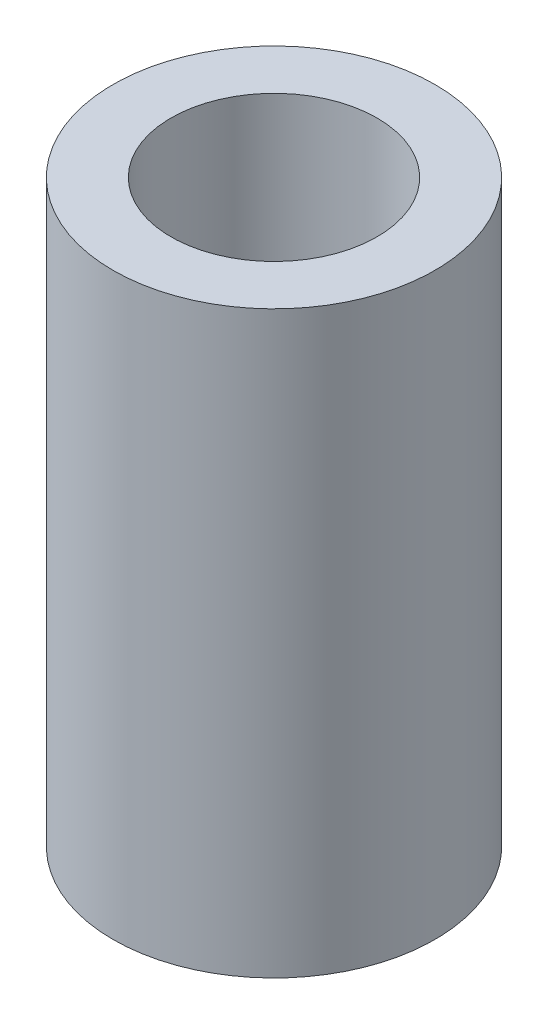
ISO-10303-21;
HEADER;
FILE_DESCRIPTION(('STEP AP214'),'2;1');
FILE_NAME('part.step','',(''),(''),'','','');
FILE_SCHEMA(('AUTOMOTIVE_DESIGN { 1 0 10303 214 1 1 1 1 }'));
ENDSEC;
DATA;
#1=APPLICATION_CONTEXT('core data for automotive mechanical design processes');
#2=APPLICATION_PROTOCOL_DEFINITION('international standard','automotive_design',2000,#1);
#3=PRODUCT_CONTEXT('',#1,'mechanical');
#4=PRODUCT('Part','Part','',(#3));
#5=PRODUCT_RELATED_PRODUCT_CATEGORY('part','',(#4));
#6=PRODUCT_DEFINITION_FORMATION('','',#4);
#7=PRODUCT_DEFINITION_CONTEXT('part definition',#1,'design');
#8=PRODUCT_DEFINITION('design','',#6,#7);
#9=PRODUCT_DEFINITION_SHAPE('','',#8);
#10=(LENGTH_UNIT() NAMED_UNIT(*) SI_UNIT(.MILLI.,.METRE.));
#11=(NAMED_UNIT(*) PLANE_ANGLE_UNIT() SI_UNIT($,.RADIAN.));
#12=(NAMED_UNIT(*) SI_UNIT($,.STERADIAN.) SOLID_ANGLE_UNIT());
#13=UNCERTAINTY_MEASURE_WITH_UNIT(LENGTH_MEASURE(1.E-05),#10,'distance_accuracy_value','');
#14=(GEOMETRIC_REPRESENTATION_CONTEXT(3) GLOBAL_UNCERTAINTY_ASSIGNED_CONTEXT((#13)) GLOBAL_UNIT_ASSIGNED_CONTEXT((#10,
#11,#12)) REPRESENTATION_CONTEXT('',''));
#15=CARTESIAN_POINT('',(0.,0.,0.));
#16=DIRECTION('',(0.,0.,1.));
#17=DIRECTION('',(1.,0.,0.));
#18=AXIS2_PLACEMENT_3D('',#15,#16,#17);
#19=CARTESIAN_POINT('',(0.,9.,0.));
#20=DIRECTION('',(0.,1.,0.));
#21=DIRECTION('',(0.,0.,-1.));
#22=AXIS2_PLACEMENT_3D('',#19,#20,#21);
#23=PLANE('',#22);
#24=CARTESIAN_POINT('',(0.,9.,0.));
#25=DIRECTION('',(0.,-1.,0.));
#26=DIRECTION('',(0.,0.,-1.));
#27=AXIS2_PLACEMENT_3D('',#24,#25,#26);
#28=CIRCLE('',#27,2.5);
#29=CARTESIAN_POINT('',(0.,9.,-2.5));
#30=VERTEX_POINT('',#29);
#31=EDGE_CURVE('E10',#30,#30,#28,.T.);
#32=ORIENTED_EDGE('',*,*,#31,.F.);
#33=EDGE_LOOP('',(#32));
#34=FACE_BOUND('',#33,.T.);
#35=CARTESIAN_POINT('',(0.,9.,0.));
#36=DIRECTION('',(0.,-1.,0.));
#37=DIRECTION('',(0.,0.,-1.));
#38=AXIS2_PLACEMENT_3D('',#35,#36,#37);
#39=CIRCLE('',#38,1.6);
#40=CARTESIAN_POINT('',(0.,9.,-1.6));
#41=VERTEX_POINT('',#40);
#42=EDGE_CURVE('E46',#41,#41,#39,.T.);
#43=ORIENTED_EDGE('',*,*,#42,.T.);
#44=EDGE_LOOP('',(#43));
#45=FACE_BOUND('',#44,.T.);
#46=ADVANCED_FACE('F35',(#34,#45),#23,.T.);
#47=CARTESIAN_POINT('',(0.,0.,0.));
#48=DIRECTION('',(0.,1.,0.));
#49=DIRECTION('',(0.,0.,-1.));
#50=AXIS2_PLACEMENT_3D('',#47,#48,#49);
#51=PLANE('',#50);
#52=CARTESIAN_POINT('',(0.,0.,0.));
#53=DIRECTION('',(0.,-1.,0.));
#54=DIRECTION('',(0.,0.,-1.));
#55=AXIS2_PLACEMENT_3D('',#52,#53,#54);
#56=CIRCLE('',#55,2.5);
#57=CARTESIAN_POINT('',(0.,0.,-2.5));
#58=VERTEX_POINT('',#57);
#59=EDGE_CURVE('E39',#58,#58,#56,.T.);
#60=ORIENTED_EDGE('',*,*,#59,.T.);
#61=EDGE_LOOP('',(#60));
#62=FACE_BOUND('',#61,.T.);
#63=CARTESIAN_POINT('',(0.,0.,0.));
#64=DIRECTION('',(0.,-1.,0.));
#65=DIRECTION('',(0.,0.,-1.));
#66=AXIS2_PLACEMENT_3D('',#63,#64,#65);
#67=CIRCLE('',#66,1.6);
#68=CARTESIAN_POINT('',(0.,0.,-1.6));
#69=VERTEX_POINT('',#68);
#70=EDGE_CURVE('E48',#69,#69,#67,.T.);
#71=ORIENTED_EDGE('',*,*,#70,.F.);
#72=EDGE_LOOP('',(#71));
#73=FACE_BOUND('',#72,.T.);
#74=ADVANCED_FACE('F61',(#62,#73),#51,.F.);
#75=CARTESIAN_POINT('',(0.,9.,0.));
#76=DIRECTION('',(0.,-1.,0.));
#77=DIRECTION('',(0.,0.,1.));
#78=AXIS2_PLACEMENT_3D('',#75,#76,#77);
#79=CYLINDRICAL_SURFACE('',#78,2.5);
#80=ORIENTED_EDGE('',*,*,#31,.T.);
#81=EDGE_LOOP('',(#80));
#82=FACE_BOUND('',#81,.T.);
#83=ORIENTED_EDGE('',*,*,#59,.F.);
#84=EDGE_LOOP('',(#83));
#85=FACE_BOUND('',#84,.T.);
#86=ADVANCED_FACE('F37',(#82,#85),#79,.T.);
#87=CARTESIAN_POINT('',(0.,9.,0.));
#88=DIRECTION('',(0.,-1.,0.));
#89=DIRECTION('',(0.,0.,1.));
#90=AXIS2_PLACEMENT_3D('',#87,#88,#89);
#91=CYLINDRICAL_SURFACE('',#90,1.6);
#92=ORIENTED_EDGE('',*,*,#42,.F.);
#93=EDGE_LOOP('',(#92));
#94=FACE_BOUND('',#93,.T.);
#95=ORIENTED_EDGE('',*,*,#70,.T.);
#96=EDGE_LOOP('',(#95));
#97=FACE_BOUND('',#96,.T.);
#98=ADVANCED_FACE('F55',(#94,#97),#91,.F.);
#99=CLOSED_SHELL('',(#46,#74,#86,#98));
#100=MANIFOLD_SOLID_BREP('B2',#99);
#101=ADVANCED_BREP_SHAPE_REPRESENTATION('',(#18,#100),#14);
#102=SHAPE_DEFINITION_REPRESENTATION(#9,#101);
ENDSEC;
END-ISO-10303-21;
